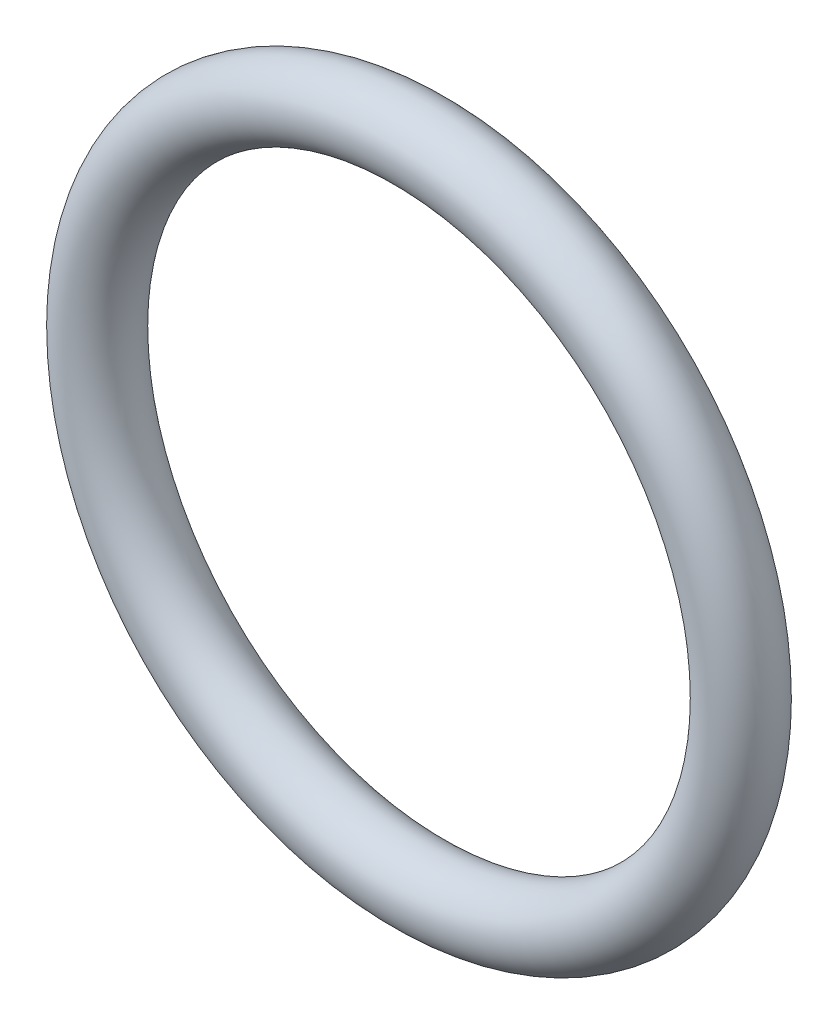
ISO-10303-21;
HEADER;
FILE_DESCRIPTION(('STEP AP214'),'2;1');
FILE_NAME('part.step','',(''),(''),'','','');
FILE_SCHEMA(('AUTOMOTIVE_DESIGN { 1 0 10303 214 1 1 1 1 }'));
ENDSEC;
DATA;
#1=APPLICATION_CONTEXT('core data for automotive mechanical design processes');
#2=APPLICATION_PROTOCOL_DEFINITION('international standard','automotive_design',2000,#1);
#3=PRODUCT_CONTEXT('',#1,'mechanical');
#4=PRODUCT('Part','Part','',(#3));
#5=PRODUCT_RELATED_PRODUCT_CATEGORY('part','',(#4));
#6=PRODUCT_DEFINITION_FORMATION('','',#4);
#7=PRODUCT_DEFINITION_CONTEXT('part definition',#1,'design');
#8=PRODUCT_DEFINITION('design','',#6,#7);
#9=PRODUCT_DEFINITION_SHAPE('','',#8);
#10=(LENGTH_UNIT() NAMED_UNIT(*) SI_UNIT(.MILLI.,.METRE.));
#11=(NAMED_UNIT(*) PLANE_ANGLE_UNIT() SI_UNIT($,.RADIAN.));
#12=(NAMED_UNIT(*) SI_UNIT($,.STERADIAN.) SOLID_ANGLE_UNIT());
#13=UNCERTAINTY_MEASURE_WITH_UNIT(LENGTH_MEASURE(1.E-05),#10,'distance_accuracy_value','');
#14=(GEOMETRIC_REPRESENTATION_CONTEXT(3) GLOBAL_UNCERTAINTY_ASSIGNED_CONTEXT((#13)) GLOBAL_UNIT_ASSIGNED_CONTEXT((#10,
#11,#12)) REPRESENTATION_CONTEXT('',''));
#15=CARTESIAN_POINT('',(0.,0.,0.));
#16=DIRECTION('',(0.,0.,1.));
#17=DIRECTION('',(1.,0.,0.));
#18=AXIS2_PLACEMENT_3D('',#15,#16,#17);
#19=CARTESIAN_POINT('',(0.,0.,0.));
#20=DIRECTION('',(0.,0.,1.));
#21=DIRECTION('',(1.,0.,0.));
#22=AXIS2_PLACEMENT_3D('',#19,#20,#21);
#23=TOROIDAL_SURFACE('',#22,13.5,1.5);
#24=CARTESIAN_POINT('',(15.,0.,0.));
#25=VERTEX_POINT('',#24);
#26=VERTEX_LOOP('',#25);
#27=FACE_BOUND('',#26,.T.);
#28=ADVANCED_FACE('F28',(#27),#23,.T.);
#29=CLOSED_SHELL('',(#28));
#30=MANIFOLD_SOLID_BREP('B2',#29);
#31=ADVANCED_BREP_SHAPE_REPRESENTATION('',(#18,#30),#14);
#32=SHAPE_DEFINITION_REPRESENTATION(#9,#31);
ENDSEC;
END-ISO-10303-21;
